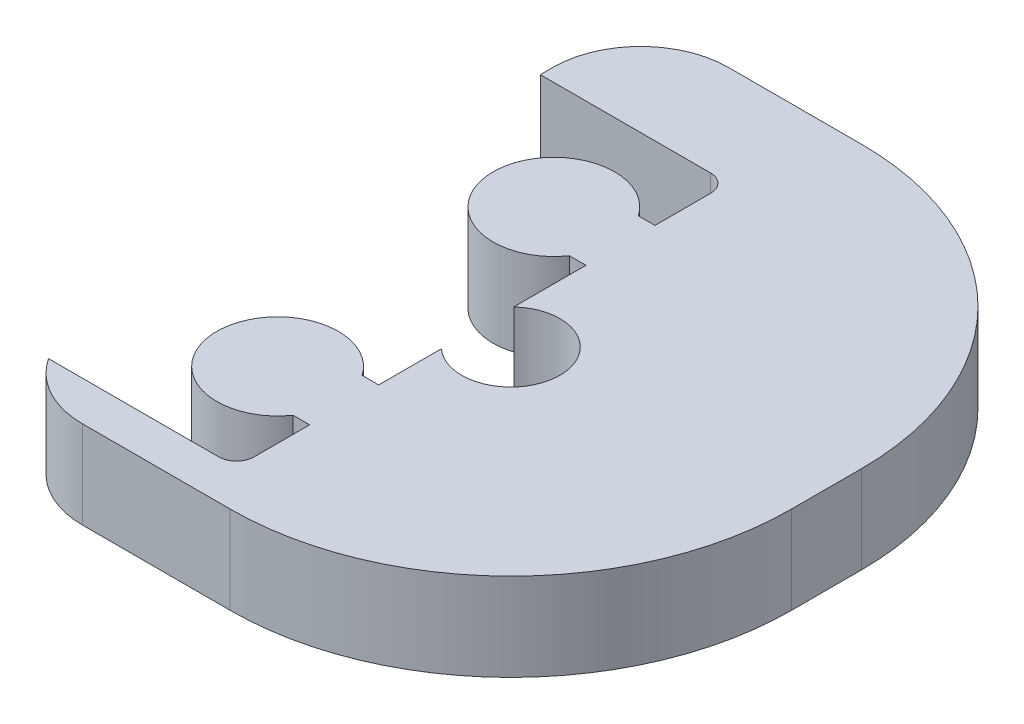
ISO-10303-21;
HEADER;
FILE_DESCRIPTION(('STEP AP214'),'2;1');
FILE_NAME('part.step','',(''),(''),'','','');
FILE_SCHEMA(('AUTOMOTIVE_DESIGN { 1 0 10303 214 1 1 1 1 }'));
ENDSEC;
DATA;
#1=APPLICATION_CONTEXT('core data for automotive mechanical design processes');
#2=APPLICATION_PROTOCOL_DEFINITION('international standard','automotive_design',2000,#1);
#3=PRODUCT_CONTEXT('',#1,'mechanical');
#4=PRODUCT('Part','Part','',(#3));
#5=PRODUCT_RELATED_PRODUCT_CATEGORY('part','',(#4));
#6=PRODUCT_DEFINITION_FORMATION('','',#4);
#7=PRODUCT_DEFINITION_CONTEXT('part definition',#1,'design');
#8=PRODUCT_DEFINITION('design','',#6,#7);
#9=PRODUCT_DEFINITION_SHAPE('','',#8);
#10=(LENGTH_UNIT() NAMED_UNIT(*) SI_UNIT(.MILLI.,.METRE.));
#11=(NAMED_UNIT(*) PLANE_ANGLE_UNIT() SI_UNIT($,.RADIAN.));
#12=(NAMED_UNIT(*) SI_UNIT($,.STERADIAN.) SOLID_ANGLE_UNIT());
#13=UNCERTAINTY_MEASURE_WITH_UNIT(LENGTH_MEASURE(1.E-05),#10,'distance_accuracy_value','');
#14=(GEOMETRIC_REPRESENTATION_CONTEXT(3) GLOBAL_UNCERTAINTY_ASSIGNED_CONTEXT((#13)) GLOBAL_UNIT_ASSIGNED_CONTEXT((#10,
#11,#12)) REPRESENTATION_CONTEXT('',''));
#15=CARTESIAN_POINT('',(0.,0.,0.));
#16=DIRECTION('',(0.,0.,1.));
#17=DIRECTION('',(1.,0.,0.));
#18=AXIS2_PLACEMENT_3D('',#15,#16,#17);
#19=CARTESIAN_POINT('',(-25.4,3.175,11.43));
#20=DIRECTION('',(0.,0.,-1.));
#21=DIRECTION('',(-1.,0.,0.));
#22=AXIS2_PLACEMENT_3D('',#19,#20,#21);
#23=PLANE('',#22);
#24=DIRECTION('',(1.,0.,0.));
#25=VECTOR('',#24,1.);
#26=CARTESIAN_POINT('',(-25.4,3.175,11.43));
#27=LINE('',#26,#25);
#28=CARTESIAN_POINT('',(9.89088521103152,3.175,11.43));
#29=VERTEX_POINT('',#28);
#30=CARTESIAN_POINT('',(15.24,3.175,11.43));
#31=VERTEX_POINT('',#30);
#32=EDGE_CURVE('E299',#29,#31,#27,.T.);
#33=ORIENTED_EDGE('',*,*,#32,.F.);
#34=DIRECTION('',(0.,1.,0.));
#35=VECTOR('',#34,1.);
#36=CARTESIAN_POINT('',(9.89088521103152,3.175,11.43));
#37=LINE('',#36,#35);
#38=CARTESIAN_POINT('',(9.89088521103152,0.,11.43));
#39=VERTEX_POINT('',#38);
#40=EDGE_CURVE('E355',#29,#39,#37,.F.);
#41=ORIENTED_EDGE('',*,*,#40,.T.);
#42=DIRECTION('',(1.,0.,0.));
#43=VECTOR('',#42,1.);
#44=CARTESIAN_POINT('',(-25.4,0.,11.43));
#45=LINE('',#44,#43);
#46=CARTESIAN_POINT('',(15.24,0.,11.43));
#47=VERTEX_POINT('',#46);
#48=EDGE_CURVE('E296',#39,#47,#45,.T.);
#49=ORIENTED_EDGE('',*,*,#48,.T.);
#50=DIRECTION('',(0.,-1.,0.));
#51=VECTOR('',#50,1.);
#52=CARTESIAN_POINT('',(15.24,3.175,11.43));
#53=LINE('',#52,#51);
#54=EDGE_CURVE('E307',#47,#31,#53,.F.);
#55=ORIENTED_EDGE('',*,*,#54,.T.);
#56=EDGE_LOOP('',(#33,#41,#49,#55));
#57=FACE_BOUND('',#56,.T.);
#58=ADVANCED_FACE('F34',(#57),#23,.F.);
#59=CARTESIAN_POINT('',(0.,3.175,0.));
#60=DIRECTION('',(0.,1.,0.));
#61=DIRECTION('',(0.,0.,1.));
#62=AXIS2_PLACEMENT_3D('',#59,#60,#61);
#63=PLANE('',#62);
#64=DIRECTION('',(-1.,0.,0.));
#65=VECTOR('',#64,1.);
#66=CARTESIAN_POINT('',(14.0390310642689,3.175,10.000889408729));
#67=LINE('',#66,#65);
#68=CARTESIAN_POINT('',(13.4040310642689,3.175,10.000889408729));
#69=VERTEX_POINT('',#68);
#70=CARTESIAN_POINT('',(7.239,3.175,10.000889408729));
#71=VERTEX_POINT('',#70);
#72=EDGE_CURVE('E207',#69,#71,#67,.T.);
#73=ORIENTED_EDGE('',*,*,#72,.T.);
#74=CARTESIAN_POINT('',(9.89088521103152,3.175,8.255));
#75=DIRECTION('',(0.,1.,0.));
#76=DIRECTION('',(0.,0.,1.));
#77=AXIS2_PLACEMENT_3D('',#74,#75,#76);
#78=CIRCLE('',#77,3.175);
#79=EDGE_CURVE('E363',#71,#29,#78,.T.);
#80=ORIENTED_EDGE('',*,*,#79,.T.);
#81=ORIENTED_EDGE('',*,*,#32,.T.);
#82=CARTESIAN_POINT('',(15.24,3.175,1.27));
#83=DIRECTION('',(0.,1.,0.));
#84=DIRECTION('',(0.,0.,1.));
#85=AXIS2_PLACEMENT_3D('',#82,#83,#84);
#86=CIRCLE('',#85,10.16);
#87=CARTESIAN_POINT('',(25.4,3.175,1.27));
#88=VERTEX_POINT('',#87);
#89=EDGE_CURVE('E318',#31,#88,#86,.T.);
#90=ORIENTED_EDGE('',*,*,#89,.T.);
#91=DIRECTION('',(0.,0.,-1.));
#92=VECTOR('',#91,1.);
#93=CARTESIAN_POINT('',(25.4,3.175,-11.43));
#94=LINE('',#93,#92);
#95=CARTESIAN_POINT('',(25.4,3.175,-1.27));
#96=VERTEX_POINT('',#95);
#97=EDGE_CURVE('E301',#88,#96,#94,.T.);
#98=ORIENTED_EDGE('',*,*,#97,.T.);
#99=CARTESIAN_POINT('',(15.24,3.175,-1.27));
#100=DIRECTION('',(0.,1.,0.));
#101=DIRECTION('',(0.,0.,1.));
#102=AXIS2_PLACEMENT_3D('',#99,#100,#101);
#103=CIRCLE('',#102,10.16);
#104=CARTESIAN_POINT('',(15.24,3.175,-11.43));
#105=VERTEX_POINT('',#104);
#106=EDGE_CURVE('E328',#96,#105,#103,.T.);
#107=ORIENTED_EDGE('',*,*,#106,.T.);
#108=DIRECTION('',(-1.,0.,0.));
#109=VECTOR('',#108,1.);
#110=CARTESIAN_POINT('',(-25.4,3.175,-11.43));
#111=LINE('',#110,#109);
#112=CARTESIAN_POINT('',(10.414,3.175,-11.43));
#113=VERTEX_POINT('',#112);
#114=EDGE_CURVE('E305',#105,#113,#111,.T.);
#115=ORIENTED_EDGE('',*,*,#114,.T.);
#116=CARTESIAN_POINT('',(10.414,3.175,-8.255));
#117=DIRECTION('',(0.,1.,0.));
#118=DIRECTION('',(0.,0.,1.));
#119=AXIS2_PLACEMENT_3D('',#116,#117,#118);
#120=CIRCLE('',#119,3.175);
#121=CARTESIAN_POINT('',(7.239,3.175,-8.255));
#122=VERTEX_POINT('',#121);
#123=EDGE_CURVE('E49',#113,#122,#120,.T.);
#124=ORIENTED_EDGE('',*,*,#123,.T.);
#125=DIRECTION('',(0.,0.,1.));
#126=VECTOR('',#125,1.);
#127=CARTESIAN_POINT('',(7.239,3.175,-11.43));
#128=LINE('',#127,#126);
#129=CARTESIAN_POINT('',(7.239,3.175,-7.79911059127095));
#130=VERTEX_POINT('',#129);
#131=EDGE_CURVE('E187',#122,#130,#128,.T.);
#132=ORIENTED_EDGE('',*,*,#131,.T.);
#133=DIRECTION('',(1.,0.,0.));
#134=VECTOR('',#133,1.);
#135=CARTESIAN_POINT('',(7.239,3.175,-7.79911059127095));
#136=LINE('',#135,#134);
#137=CARTESIAN_POINT('',(13.4040310642689,3.175,-7.79911059127095));
#138=VERTEX_POINT('',#137);
#139=EDGE_CURVE('E191',#130,#138,#136,.T.);
#140=ORIENTED_EDGE('',*,*,#139,.T.);
#141=CARTESIAN_POINT('',(13.4040310642689,3.175,-7.16411059127095));
#142=DIRECTION('',(0.,1.,0.));
#143=DIRECTION('',(0.,0.,1.));
#144=AXIS2_PLACEMENT_3D('',#141,#142,#143);
#145=CIRCLE('',#144,0.635);
#146=CARTESIAN_POINT('',(14.0390310642689,3.175,-7.16411059127095));
#147=VERTEX_POINT('',#146);
#148=EDGE_CURVE('E353',#138,#147,#145,.F.);
#149=ORIENTED_EDGE('',*,*,#148,.T.);
#150=DIRECTION('',(0.,0.,1.));
#151=VECTOR('',#150,1.);
#152=CARTESIAN_POINT('',(14.0390310642689,3.175,-7.79911059127095));
#153=LINE('',#152,#151);
#154=CARTESIAN_POINT('',(14.0390310642689,3.175,-5.14911059127096));
#155=VERTEX_POINT('',#154);
#156=EDGE_CURVE('E212',#147,#155,#153,.T.);
#157=ORIENTED_EDGE('',*,*,#156,.T.);
#158=DIRECTION('',(1.,0.,0.));
#159=VECTOR('',#158,1.);
#160=CARTESIAN_POINT('',(13.4390310642689,3.175,-5.14911059127096));
#161=LINE('',#160,#159);
#162=CARTESIAN_POINT('',(13.4390310642689,3.175,-5.14911059127096));
#163=VERTEX_POINT('',#162);
#164=EDGE_CURVE('E214',#163,#155,#161,.T.);
#165=ORIENTED_EDGE('',*,*,#164,.F.);
#166=CARTESIAN_POINT('',(11.6286443652424,3.175,-3.89911059127096));
#167=DIRECTION('',(0.,1.,0.));
#168=DIRECTION('',(0.,0.,1.));
#169=AXIS2_PLACEMENT_3D('',#166,#167,#168);
#170=CIRCLE('',#169,2.20000000000277);
#171=CARTESIAN_POINT('',(13.4390310642689,3.175,-2.64911059127096));
#172=VERTEX_POINT('',#171);
#173=EDGE_CURVE('E219',#163,#172,#170,.T.);
#174=ORIENTED_EDGE('',*,*,#173,.T.);
#175=DIRECTION('',(1.,0.,0.));
#176=VECTOR('',#175,1.);
#177=CARTESIAN_POINT('',(13.4390310642689,3.175,-2.64911059127096));
#178=LINE('',#177,#176);
#179=CARTESIAN_POINT('',(14.0390310642689,3.175,-2.64911059127096));
#180=VERTEX_POINT('',#179);
#181=EDGE_CURVE('E222',#172,#180,#178,.T.);
#182=ORIENTED_EDGE('',*,*,#181,.T.);
#183=DIRECTION('',(0.,0.,1.));
#184=VECTOR('',#183,1.);
#185=CARTESIAN_POINT('',(14.0390310642689,3.175,-2.64911059127096));
#186=LINE('',#185,#184);
#187=CARTESIAN_POINT('',(14.0390310642689,3.175,-0.0410902392318066));
#188=VERTEX_POINT('',#187);
#189=EDGE_CURVE('E226',#180,#188,#186,.T.);
#190=ORIENTED_EDGE('',*,*,#189,.T.);
#191=CARTESIAN_POINT('',(15.24,3.175,1.27));
#192=DIRECTION('',(0.,1.,0.));
#193=DIRECTION('',(0.,0.,1.));
#194=AXIS2_PLACEMENT_3D('',#191,#192,#193);
#195=CIRCLE('',#194,1.778);
#196=CARTESIAN_POINT('',(14.0390310642689,3.175,2.58109023923181));
#197=VERTEX_POINT('',#196);
#198=EDGE_CURVE('E275',#197,#188,#195,.T.);
#199=ORIENTED_EDGE('',*,*,#198,.F.);
#200=CARTESIAN_POINT('',(14.0390310642689,3.175,4.85088940872904));
#201=VERTEX_POINT('',#200);
#202=EDGE_CURVE('E225',#197,#201,#186,.T.);
#203=ORIENTED_EDGE('',*,*,#202,.T.);
#204=DIRECTION('',(1.,0.,0.));
#205=VECTOR('',#204,1.);
#206=CARTESIAN_POINT('',(13.4390310642689,3.175,4.85088940872904));
#207=LINE('',#206,#205);
#208=CARTESIAN_POINT('',(13.4390310642689,3.175,4.85088940872904));
#209=VERTEX_POINT('',#208);
#210=EDGE_CURVE('E229',#209,#201,#207,.T.);
#211=ORIENTED_EDGE('',*,*,#210,.F.);
#212=CARTESIAN_POINT('',(11.6286443657494,3.175,6.10088940872904));
#213=DIRECTION('',(0.,1.,0.));
#214=DIRECTION('',(0.,0.,1.));
#215=AXIS2_PLACEMENT_3D('',#212,#213,#214);
#216=CIRCLE('',#215,2.19999999958551);
#217=CARTESIAN_POINT('',(13.4390310642689,3.175,7.35088940872904));
#218=VERTEX_POINT('',#217);
#219=EDGE_CURVE('E231',#209,#218,#216,.T.);
#220=ORIENTED_EDGE('',*,*,#219,.T.);
#221=DIRECTION('',(1.,0.,0.));
#222=VECTOR('',#221,1.);
#223=CARTESIAN_POINT('',(13.4390310642689,3.175,7.35088940872904));
#224=LINE('',#223,#222);
#225=CARTESIAN_POINT('',(14.0390310642689,3.175,7.35088940872904));
#226=VERTEX_POINT('',#225);
#227=EDGE_CURVE('E234',#218,#226,#224,.T.);
#228=ORIENTED_EDGE('',*,*,#227,.T.);
#229=DIRECTION('',(0.,0.,1.));
#230=VECTOR('',#229,1.);
#231=CARTESIAN_POINT('',(14.0390310642689,3.175,7.35088940872904));
#232=LINE('',#231,#230);
#233=CARTESIAN_POINT('',(14.0390310642689,3.175,9.36588940872905));
#234=VERTEX_POINT('',#233);
#235=EDGE_CURVE('E237',#226,#234,#232,.T.);
#236=ORIENTED_EDGE('',*,*,#235,.T.);
#237=CARTESIAN_POINT('',(13.4040310642689,3.175,9.36588940872905));
#238=DIRECTION('',(0.,1.,0.));
#239=DIRECTION('',(0.,0.,1.));
#240=AXIS2_PLACEMENT_3D('',#237,#238,#239);
#241=CIRCLE('',#240,0.635);
#242=EDGE_CURVE('E349',#234,#69,#241,.F.);
#243=ORIENTED_EDGE('',*,*,#242,.T.);
#244=EDGE_LOOP('',(#73,#80,#81,#90,#98,#107,#115,#124,#132,#140,#149,#157,#165,#174,#182,#190,
#199,#203,#211,#220,#228,#236,#243));
#245=FACE_BOUND('',#244,.T.);
#246=ADVANCED_FACE('F189',(#245),#63,.T.);
#247=CARTESIAN_POINT('',(0.,0.,0.));
#248=DIRECTION('',(0.,1.,0.));
#249=DIRECTION('',(0.,0.,1.));
#250=AXIS2_PLACEMENT_3D('',#247,#248,#249);
#251=PLANE('',#250);
#252=ORIENTED_EDGE('',*,*,#48,.F.);
#253=CARTESIAN_POINT('',(9.89088521103152,0.,8.255));
#254=DIRECTION('',(0.,1.,0.));
#255=DIRECTION('',(0.,0.,1.));
#256=AXIS2_PLACEMENT_3D('',#253,#254,#255);
#257=CIRCLE('',#256,3.175);
#258=CARTESIAN_POINT('',(7.239,0.,10.000889408729));
#259=VERTEX_POINT('',#258);
#260=EDGE_CURVE('E360',#39,#259,#257,.F.);
#261=ORIENTED_EDGE('',*,*,#260,.T.);
#262=DIRECTION('',(-1.,0.,0.));
#263=VECTOR('',#262,1.);
#264=CARTESIAN_POINT('',(14.0390310642689,0.,10.000889408729));
#265=LINE('',#264,#263);
#266=CARTESIAN_POINT('',(13.4040310642689,0.,10.000889408729));
#267=VERTEX_POINT('',#266);
#268=EDGE_CURVE('E196',#267,#259,#265,.T.);
#269=ORIENTED_EDGE('',*,*,#268,.F.);
#270=CARTESIAN_POINT('',(13.4040310642689,0.,9.36588940872905));
#271=DIRECTION('',(0.,1.,0.));
#272=DIRECTION('',(0.,0.,1.));
#273=AXIS2_PLACEMENT_3D('',#270,#271,#272);
#274=CIRCLE('',#273,0.635);
#275=CARTESIAN_POINT('',(14.0390310642689,0.,9.36588940872905));
#276=VERTEX_POINT('',#275);
#277=EDGE_CURVE('E347',#267,#276,#274,.T.);
#278=ORIENTED_EDGE('',*,*,#277,.T.);
#279=DIRECTION('',(0.,0.,1.));
#280=VECTOR('',#279,1.);
#281=CARTESIAN_POINT('',(14.0390310642689,0.,7.35088940872904));
#282=LINE('',#281,#280);
#283=CARTESIAN_POINT('',(14.0390310642689,0.,7.35088940872904));
#284=VERTEX_POINT('',#283);
#285=EDGE_CURVE('E267',#284,#276,#282,.T.);
#286=ORIENTED_EDGE('',*,*,#285,.F.);
#287=DIRECTION('',(1.,0.,0.));
#288=VECTOR('',#287,1.);
#289=CARTESIAN_POINT('',(13.4390310642689,0.,7.35088940872904));
#290=LINE('',#289,#288);
#291=CARTESIAN_POINT('',(13.4390310642689,0.,7.35088940872904));
#292=VERTEX_POINT('',#291);
#293=EDGE_CURVE('E264',#292,#284,#290,.T.);
#294=ORIENTED_EDGE('',*,*,#293,.F.);
#295=CARTESIAN_POINT('',(11.6286443657494,0.,6.10088940872904));
#296=DIRECTION('',(0.,1.,0.));
#297=DIRECTION('',(0.,0.,1.));
#298=AXIS2_PLACEMENT_3D('',#295,#296,#297);
#299=CIRCLE('',#298,2.19999999958551);
#300=CARTESIAN_POINT('',(13.4390310642689,0.,4.85088940872904));
#301=VERTEX_POINT('',#300);
#302=EDGE_CURVE('E261',#301,#292,#299,.T.);
#303=ORIENTED_EDGE('',*,*,#302,.F.);
#304=DIRECTION('',(1.,0.,0.));
#305=VECTOR('',#304,1.);
#306=CARTESIAN_POINT('',(13.4390310642689,0.,4.85088940872904));
#307=LINE('',#306,#305);
#308=CARTESIAN_POINT('',(14.0390310642689,0.,4.85088940872904));
#309=VERTEX_POINT('',#308);
#310=EDGE_CURVE('E258',#301,#309,#307,.T.);
#311=ORIENTED_EDGE('',*,*,#310,.T.);
#312=DIRECTION('',(0.,0.,1.));
#313=VECTOR('',#312,1.);
#314=CARTESIAN_POINT('',(14.0390310642689,0.,-2.64911059127096));
#315=LINE('',#314,#313);
#316=CARTESIAN_POINT('',(14.0390310642689,0.,2.58109023923181));
#317=VERTEX_POINT('',#316);
#318=EDGE_CURVE('E255',#317,#309,#315,.T.);
#319=ORIENTED_EDGE('',*,*,#318,.F.);
#320=CARTESIAN_POINT('',(15.24,0.,1.27));
#321=DIRECTION('',(0.,1.,0.));
#322=DIRECTION('',(0.,0.,1.));
#323=AXIS2_PLACEMENT_3D('',#320,#321,#322);
#324=CIRCLE('',#323,1.778);
#325=CARTESIAN_POINT('',(14.0390310642689,0.,-0.0410902392318068));
#326=VERTEX_POINT('',#325);
#327=EDGE_CURVE('E293',#317,#326,#324,.T.);
#328=ORIENTED_EDGE('',*,*,#327,.T.);
#329=CARTESIAN_POINT('',(14.0390310642689,0.,-2.64911059127096));
#330=VERTEX_POINT('',#329);
#331=EDGE_CURVE('E256',#330,#326,#315,.T.);
#332=ORIENTED_EDGE('',*,*,#331,.F.);
#333=DIRECTION('',(1.,0.,0.));
#334=VECTOR('',#333,1.);
#335=CARTESIAN_POINT('',(13.4390310642689,0.,-2.64911059127096));
#336=LINE('',#335,#334);
#337=CARTESIAN_POINT('',(13.4390310642689,0.,-2.64911059127096));
#338=VERTEX_POINT('',#337);
#339=EDGE_CURVE('E252',#338,#330,#336,.T.);
#340=ORIENTED_EDGE('',*,*,#339,.F.);
#341=CARTESIAN_POINT('',(11.6286443652424,0.,-3.89911059127096));
#342=DIRECTION('',(0.,1.,0.));
#343=DIRECTION('',(0.,0.,1.));
#344=AXIS2_PLACEMENT_3D('',#341,#342,#343);
#345=CIRCLE('',#344,2.20000000000277);
#346=CARTESIAN_POINT('',(13.4390310642689,0.,-5.14911059127096));
#347=VERTEX_POINT('',#346);
#348=EDGE_CURVE('E249',#347,#338,#345,.T.);
#349=ORIENTED_EDGE('',*,*,#348,.F.);
#350=DIRECTION('',(1.,0.,0.));
#351=VECTOR('',#350,1.);
#352=CARTESIAN_POINT('',(13.4390310642689,0.,-5.14911059127096));
#353=LINE('',#352,#351);
#354=CARTESIAN_POINT('',(14.0390310642689,0.,-5.14911059127096));
#355=VERTEX_POINT('',#354);
#356=EDGE_CURVE('E246',#347,#355,#353,.T.);
#357=ORIENTED_EDGE('',*,*,#356,.T.);
#358=DIRECTION('',(0.,0.,1.));
#359=VECTOR('',#358,1.);
#360=CARTESIAN_POINT('',(14.0390310642689,0.,-7.79911059127095));
#361=LINE('',#360,#359);
#362=CARTESIAN_POINT('',(14.0390310642689,0.,-7.16411059127095));
#363=VERTEX_POINT('',#362);
#364=EDGE_CURVE('E244',#363,#355,#361,.T.);
#365=ORIENTED_EDGE('',*,*,#364,.F.);
#366=CARTESIAN_POINT('',(13.4040310642689,0.,-7.16411059127095));
#367=DIRECTION('',(0.,1.,0.));
#368=DIRECTION('',(0.,0.,1.));
#369=AXIS2_PLACEMENT_3D('',#366,#367,#368);
#370=CIRCLE('',#369,0.635);
#371=CARTESIAN_POINT('',(13.4040310642689,0.,-7.79911059127095));
#372=VERTEX_POINT('',#371);
#373=EDGE_CURVE('E351',#363,#372,#370,.T.);
#374=ORIENTED_EDGE('',*,*,#373,.T.);
#375=DIRECTION('',(1.,0.,0.));
#376=VECTOR('',#375,1.);
#377=CARTESIAN_POINT('',(7.239,0.,-7.79911059127095));
#378=LINE('',#377,#376);
#379=CARTESIAN_POINT('',(7.239,0.,-7.79911059127095));
#380=VERTEX_POINT('',#379);
#381=EDGE_CURVE('E242',#380,#372,#378,.T.);
#382=ORIENTED_EDGE('',*,*,#381,.F.);
#383=DIRECTION('',(0.,0.,1.));
#384=VECTOR('',#383,1.);
#385=CARTESIAN_POINT('',(7.239,0.,-11.43));
#386=LINE('',#385,#384);
#387=CARTESIAN_POINT('',(7.239,0.,-8.255));
#388=VERTEX_POINT('',#387);
#389=EDGE_CURVE('E202',#388,#380,#386,.T.);
#390=ORIENTED_EDGE('',*,*,#389,.F.);
#391=CARTESIAN_POINT('',(10.414,0.,-8.255));
#392=DIRECTION('',(0.,1.,0.));
#393=DIRECTION('',(0.,0.,1.));
#394=AXIS2_PLACEMENT_3D('',#391,#392,#393);
#395=CIRCLE('',#394,3.175);
#396=CARTESIAN_POINT('',(10.414,0.,-11.43));
#397=VERTEX_POINT('',#396);
#398=EDGE_CURVE('E358',#388,#397,#395,.F.);
#399=ORIENTED_EDGE('',*,*,#398,.T.);
#400=DIRECTION('',(-1.,0.,0.));
#401=VECTOR('',#400,1.);
#402=CARTESIAN_POINT('',(-25.4,0.,-11.43));
#403=LINE('',#402,#401);
#404=CARTESIAN_POINT('',(15.24,0.,-11.43));
#405=VERTEX_POINT('',#404);
#406=EDGE_CURVE('E302',#405,#397,#403,.T.);
#407=ORIENTED_EDGE('',*,*,#406,.F.);
#408=CARTESIAN_POINT('',(15.24,0.,-1.27));
#409=DIRECTION('',(0.,1.,0.));
#410=DIRECTION('',(0.,0.,1.));
#411=AXIS2_PLACEMENT_3D('',#408,#409,#410);
#412=CIRCLE('',#411,10.16);
#413=CARTESIAN_POINT('',(25.4,0.,-1.27));
#414=VERTEX_POINT('',#413);
#415=EDGE_CURVE('E323',#405,#414,#412,.F.);
#416=ORIENTED_EDGE('',*,*,#415,.T.);
#417=DIRECTION('',(0.,0.,-1.));
#418=VECTOR('',#417,1.);
#419=CARTESIAN_POINT('',(25.4,0.,-11.43));
#420=LINE('',#419,#418);
#421=CARTESIAN_POINT('',(25.4,0.,1.27));
#422=VERTEX_POINT('',#421);
#423=EDGE_CURVE('E309',#422,#414,#420,.T.);
#424=ORIENTED_EDGE('',*,*,#423,.F.);
#425=CARTESIAN_POINT('',(15.24,0.,1.27));
#426=DIRECTION('',(0.,1.,0.));
#427=DIRECTION('',(0.,0.,1.));
#428=AXIS2_PLACEMENT_3D('',#425,#426,#427);
#429=CIRCLE('',#428,10.16);
#430=EDGE_CURVE('E315',#422,#47,#429,.F.);
#431=ORIENTED_EDGE('',*,*,#430,.T.);
#432=EDGE_LOOP('',(#252,#261,#269,#278,#286,#294,#303,#311,#319,#328,#332,#340,#349,#357,#365,
#374,#382,#390,#399,#407,#416,#424,#431));
#433=FACE_BOUND('',#432,.T.);
#434=ADVANCED_FACE('F367',(#433),#251,.F.);
#435=CARTESIAN_POINT('',(25.4,3.175,-11.43));
#436=DIRECTION('',(-1.,0.,0.));
#437=DIRECTION('',(0.,0.,1.));
#438=AXIS2_PLACEMENT_3D('',#435,#436,#437);
#439=PLANE('',#438);
#440=ORIENTED_EDGE('',*,*,#423,.T.);
#441=DIRECTION('',(0.,-1.,0.));
#442=VECTOR('',#441,1.);
#443=CARTESIAN_POINT('',(25.4,3.175,-1.27));
#444=LINE('',#443,#442);
#445=EDGE_CURVE('E330',#414,#96,#444,.F.);
#446=ORIENTED_EDGE('',*,*,#445,.T.);
#447=ORIENTED_EDGE('',*,*,#97,.F.);
#448=DIRECTION('',(0.,-1.,0.));
#449=VECTOR('',#448,1.);
#450=CARTESIAN_POINT('',(25.4,3.175,1.27));
#451=LINE('',#450,#449);
#452=EDGE_CURVE('E320',#88,#422,#451,.T.);
#453=ORIENTED_EDGE('',*,*,#452,.T.);
#454=EDGE_LOOP('',(#440,#446,#447,#453));
#455=FACE_BOUND('',#454,.T.);
#456=ADVANCED_FACE('F441',(#455),#439,.F.);
#457=CARTESIAN_POINT('',(-25.4,3.175,-11.43));
#458=DIRECTION('',(0.,0.,1.));
#459=DIRECTION('',(1.,0.,0.));
#460=AXIS2_PLACEMENT_3D('',#457,#458,#459);
#461=PLANE('',#460);
#462=ORIENTED_EDGE('',*,*,#406,.T.);
#463=DIRECTION('',(0.,-1.,0.));
#464=VECTOR('',#463,1.);
#465=CARTESIAN_POINT('',(10.414,3.175,-11.43));
#466=LINE('',#465,#464);
#467=EDGE_CURVE('E11',#397,#113,#466,.F.);
#468=ORIENTED_EDGE('',*,*,#467,.T.);
#469=ORIENTED_EDGE('',*,*,#114,.F.);
#470=DIRECTION('',(0.,-1.,0.));
#471=VECTOR('',#470,1.);
#472=CARTESIAN_POINT('',(15.24,3.175,-11.43));
#473=LINE('',#472,#471);
#474=EDGE_CURVE('E325',#105,#405,#473,.T.);
#475=ORIENTED_EDGE('',*,*,#474,.T.);
#476=EDGE_LOOP('',(#462,#468,#469,#475));
#477=FACE_BOUND('',#476,.T.);
#478=ADVANCED_FACE('F448',(#477),#461,.F.);
#479=CARTESIAN_POINT('',(15.24,3.175,1.27));
#480=DIRECTION('',(0.,-1.,0.));
#481=DIRECTION('',(0.,0.,-1.));
#482=AXIS2_PLACEMENT_3D('',#479,#480,#481);
#483=CYLINDRICAL_SURFACE('',#482,10.16);
#484=ORIENTED_EDGE('',*,*,#89,.F.);
#485=ORIENTED_EDGE('',*,*,#54,.F.);
#486=ORIENTED_EDGE('',*,*,#430,.F.);
#487=ORIENTED_EDGE('',*,*,#452,.F.);
#488=EDGE_LOOP('',(#484,#485,#486,#487));
#489=FACE_BOUND('',#488,.T.);
#490=ADVANCED_FACE('F444',(#489),#483,.T.);
#491=CARTESIAN_POINT('',(15.24,0.,1.27));
#492=DIRECTION('',(0.,1.,0.));
#493=DIRECTION('',(0.,0.,1.));
#494=AXIS2_PLACEMENT_3D('',#491,#492,#493);
#495=CYLINDRICAL_SURFACE('',#494,1.778);
#496=ORIENTED_EDGE('',*,*,#198,.T.);
#497=DIRECTION('',(0.,1.,0.));
#498=VECTOR('',#497,1.);
#499=CARTESIAN_POINT('',(14.0390310642689,0.,-0.0410902392318066));
#500=LINE('',#499,#498);
#501=EDGE_CURVE('E335',#188,#326,#500,.F.);
#502=ORIENTED_EDGE('',*,*,#501,.T.);
#503=ORIENTED_EDGE('',*,*,#327,.F.);
#504=DIRECTION('',(0.,1.,0.));
#505=VECTOR('',#504,1.);
#506=CARTESIAN_POINT('',(14.0390310642689,0.,2.58109023923181));
#507=LINE('',#506,#505);
#508=EDGE_CURVE('E332',#317,#197,#507,.T.);
#509=ORIENTED_EDGE('',*,*,#508,.T.);
#510=EDGE_LOOP('',(#496,#502,#503,#509));
#511=FACE_BOUND('',#510,.T.);
#512=ADVANCED_FACE('F396',(#511),#495,.F.);
#513=CARTESIAN_POINT('',(15.24,3.175,-1.27));
#514=DIRECTION('',(0.,-1.,0.));
#515=DIRECTION('',(0.,0.,-1.));
#516=AXIS2_PLACEMENT_3D('',#513,#514,#515);
#517=CYLINDRICAL_SURFACE('',#516,10.16);
#518=ORIENTED_EDGE('',*,*,#106,.F.);
#519=ORIENTED_EDGE('',*,*,#445,.F.);
#520=ORIENTED_EDGE('',*,*,#415,.F.);
#521=ORIENTED_EDGE('',*,*,#474,.F.);
#522=EDGE_LOOP('',(#518,#519,#520,#521));
#523=FACE_BOUND('',#522,.T.);
#524=ADVANCED_FACE('F446',(#523),#517,.T.);
#525=CARTESIAN_POINT('',(14.0390310642689,3.175,-2.64911059127096));
#526=DIRECTION('',(1.,0.,0.));
#527=DIRECTION('',(0.,0.,-1.));
#528=AXIS2_PLACEMENT_3D('',#525,#526,#527);
#529=PLANE('',#528);
#530=ORIENTED_EDGE('',*,*,#318,.T.);
#531=DIRECTION('',(0.,-1.,0.));
#532=VECTOR('',#531,1.);
#533=CARTESIAN_POINT('',(14.0390310642689,3.175,4.85088940872904));
#534=LINE('',#533,#532);
#535=EDGE_CURVE('E282',#201,#309,#534,.T.);
#536=ORIENTED_EDGE('',*,*,#535,.F.);
#537=ORIENTED_EDGE('',*,*,#202,.F.);
#538=ORIENTED_EDGE('',*,*,#508,.F.);
#539=EDGE_LOOP('',(#530,#536,#537,#538));
#540=FACE_BOUND('',#539,.T.);
#541=ADVANCED_FACE('F402',(#540),#529,.F.);
#542=CARTESIAN_POINT('',(13.4390310642689,3.175,4.85088940872904));
#543=DIRECTION('',(0.,0.,-1.));
#544=DIRECTION('',(-1.,0.,0.));
#545=AXIS2_PLACEMENT_3D('',#542,#543,#544);
#546=PLANE('',#545);
#547=ORIENTED_EDGE('',*,*,#310,.F.);
#548=DIRECTION('',(0.,-1.,0.));
#549=VECTOR('',#548,1.);
#550=CARTESIAN_POINT('',(13.4390310642689,3.175,4.85088940872904));
#551=LINE('',#550,#549);
#552=EDGE_CURVE('E280',#209,#301,#551,.T.);
#553=ORIENTED_EDGE('',*,*,#552,.F.);
#554=ORIENTED_EDGE('',*,*,#210,.T.);
#555=ORIENTED_EDGE('',*,*,#535,.T.);
#556=EDGE_LOOP('',(#547,#553,#554,#555));
#557=FACE_BOUND('',#556,.T.);
#558=ADVANCED_FACE('F405',(#557),#546,.T.);
#559=CARTESIAN_POINT('',(11.6286443657494,3.175,6.10088940872904));
#560=DIRECTION('',(0.,-1.,0.));
#561=DIRECTION('',(0.,0.,-1.));
#562=AXIS2_PLACEMENT_3D('',#559,#560,#561);
#563=CYLINDRICAL_SURFACE('',#562,2.19999999958551);
#564=ORIENTED_EDGE('',*,*,#302,.T.);
#565=DIRECTION('',(0.,-1.,0.));
#566=VECTOR('',#565,1.);
#567=CARTESIAN_POINT('',(13.4390310642689,3.175,7.35088940872904));
#568=LINE('',#567,#566);
#569=EDGE_CURVE('E278',#218,#292,#568,.T.);
#570=ORIENTED_EDGE('',*,*,#569,.F.);
#571=ORIENTED_EDGE('',*,*,#219,.F.);
#572=ORIENTED_EDGE('',*,*,#552,.T.);
#573=EDGE_LOOP('',(#564,#570,#571,#572));
#574=FACE_BOUND('',#573,.T.);
#575=ADVANCED_FACE('F410',(#574),#563,.T.);
#576=CARTESIAN_POINT('',(13.4390310642689,3.175,7.35088940872904));
#577=DIRECTION('',(0.,0.,-1.));
#578=DIRECTION('',(-1.,0.,0.));
#579=AXIS2_PLACEMENT_3D('',#576,#577,#578);
#580=PLANE('',#579);
#581=ORIENTED_EDGE('',*,*,#293,.T.);
#582=DIRECTION('',(0.,-1.,0.));
#583=VECTOR('',#582,1.);
#584=CARTESIAN_POINT('',(14.0390310642689,3.175,7.35088940872904));
#585=LINE('',#584,#583);
#586=EDGE_CURVE('E276',#226,#284,#585,.T.);
#587=ORIENTED_EDGE('',*,*,#586,.F.);
#588=ORIENTED_EDGE('',*,*,#227,.F.);
#589=ORIENTED_EDGE('',*,*,#569,.T.);
#590=EDGE_LOOP('',(#581,#587,#588,#589));
#591=FACE_BOUND('',#590,.T.);
#592=ADVANCED_FACE('F413',(#591),#580,.F.);
#593=CARTESIAN_POINT('',(14.0390310642689,3.175,7.35088940872904));
#594=DIRECTION('',(1.,0.,0.));
#595=DIRECTION('',(0.,0.,-1.));
#596=AXIS2_PLACEMENT_3D('',#593,#594,#595);
#597=PLANE('',#596);
#598=ORIENTED_EDGE('',*,*,#285,.T.);
#599=DIRECTION('',(0.,-1.,0.));
#600=VECTOR('',#599,1.);
#601=CARTESIAN_POINT('',(14.0390310642689,3.175,9.36588940872905));
#602=LINE('',#601,#600);
#603=EDGE_CURVE('E341',#276,#234,#602,.F.);
#604=ORIENTED_EDGE('',*,*,#603,.T.);
#605=ORIENTED_EDGE('',*,*,#235,.F.);
#606=ORIENTED_EDGE('',*,*,#586,.T.);
#607=EDGE_LOOP('',(#598,#604,#605,#606));
#608=FACE_BOUND('',#607,.T.);
#609=ADVANCED_FACE('F417',(#608),#597,.F.);
#610=CARTESIAN_POINT('',(14.0390310642689,3.175,10.000889408729));
#611=DIRECTION('',(0.,0.,1.));
#612=DIRECTION('',(1.,0.,0.));
#613=AXIS2_PLACEMENT_3D('',#610,#611,#612);
#614=PLANE('',#613);
#615=ORIENTED_EDGE('',*,*,#72,.F.);
#616=DIRECTION('',(0.,-1.,0.));
#617=VECTOR('',#616,1.);
#618=CARTESIAN_POINT('',(13.4040310642689,0.,10.000889408729));
#619=LINE('',#618,#617);
#620=EDGE_CURVE('E338',#69,#267,#619,.T.);
#621=ORIENTED_EDGE('',*,*,#620,.T.);
#622=ORIENTED_EDGE('',*,*,#268,.T.);
#623=DIRECTION('',(0.,-1.,0.));
#624=VECTOR('',#623,1.);
#625=CARTESIAN_POINT('',(7.239,3.175,10.000889408729));
#626=LINE('',#625,#624);
#627=EDGE_CURVE('E272',#71,#259,#626,.T.);
#628=ORIENTED_EDGE('',*,*,#627,.F.);
#629=EDGE_LOOP('',(#615,#621,#622,#628));
#630=FACE_BOUND('',#629,.T.);
#631=ADVANCED_FACE('F426',(#630),#614,.F.);
#632=ORIENTED_EDGE('',*,*,#189,.F.);
#633=DIRECTION('',(0.,-1.,0.));
#634=VECTOR('',#633,1.);
#635=CARTESIAN_POINT('',(14.0390310642689,3.175,-2.64911059127096));
#636=LINE('',#635,#634);
#637=EDGE_CURVE('E285',#180,#330,#636,.T.);
#638=ORIENTED_EDGE('',*,*,#637,.T.);
#639=ORIENTED_EDGE('',*,*,#331,.T.);
#640=ORIENTED_EDGE('',*,*,#501,.F.);
#641=EDGE_LOOP('',(#632,#638,#639,#640));
#642=FACE_BOUND('',#641,.T.);
#643=ADVANCED_FACE('F393',(#642),#529,.F.);
#644=CARTESIAN_POINT('',(7.239,3.175,-11.43));
#645=DIRECTION('',(1.,0.,0.));
#646=DIRECTION('',(0.,0.,-1.));
#647=AXIS2_PLACEMENT_3D('',#644,#645,#646);
#648=PLANE('',#647);
#649=ORIENTED_EDGE('',*,*,#131,.F.);
#650=DIRECTION('',(0.,-1.,0.));
#651=VECTOR('',#650,1.);
#652=CARTESIAN_POINT('',(7.239,3.175,-8.255));
#653=LINE('',#652,#651);
#654=EDGE_CURVE('E42',#122,#388,#653,.T.);
#655=ORIENTED_EDGE('',*,*,#654,.T.);
#656=ORIENTED_EDGE('',*,*,#389,.T.);
#657=DIRECTION('',(0.,-1.,0.));
#658=VECTOR('',#657,1.);
#659=CARTESIAN_POINT('',(7.239,3.175,-7.79911059127095));
#660=LINE('',#659,#658);
#661=EDGE_CURVE('E199',#130,#380,#660,.T.);
#662=ORIENTED_EDGE('',*,*,#661,.F.);
#663=EDGE_LOOP('',(#649,#655,#656,#662));
#664=FACE_BOUND('',#663,.T.);
#665=ADVANCED_FACE('F200',(#664),#648,.F.);
#666=CARTESIAN_POINT('',(13.4390310642689,3.175,-2.64911059127096));
#667=DIRECTION('',(0.,0.,-1.));
#668=DIRECTION('',(-1.,0.,0.));
#669=AXIS2_PLACEMENT_3D('',#666,#667,#668);
#670=PLANE('',#669);
#671=ORIENTED_EDGE('',*,*,#339,.T.);
#672=ORIENTED_EDGE('',*,*,#637,.F.);
#673=ORIENTED_EDGE('',*,*,#181,.F.);
#674=DIRECTION('',(0.,-1.,0.));
#675=VECTOR('',#674,1.);
#676=CARTESIAN_POINT('',(13.4390310642689,3.175,-2.64911059127096));
#677=LINE('',#676,#675);
#678=EDGE_CURVE('E287',#172,#338,#677,.T.);
#679=ORIENTED_EDGE('',*,*,#678,.T.);
#680=EDGE_LOOP('',(#671,#672,#673,#679));
#681=FACE_BOUND('',#680,.T.);
#682=ADVANCED_FACE('F391',(#681),#670,.F.);
#683=CARTESIAN_POINT('',(11.6286443652424,3.175,-3.89911059127096));
#684=DIRECTION('',(0.,-1.,0.));
#685=DIRECTION('',(0.,0.,-1.));
#686=AXIS2_PLACEMENT_3D('',#683,#684,#685);
#687=CYLINDRICAL_SURFACE('',#686,2.20000000000277);
#688=ORIENTED_EDGE('',*,*,#348,.T.);
#689=ORIENTED_EDGE('',*,*,#678,.F.);
#690=ORIENTED_EDGE('',*,*,#173,.F.);
#691=DIRECTION('',(0.,-1.,0.));
#692=VECTOR('',#691,1.);
#693=CARTESIAN_POINT('',(13.4390310642689,3.175,-5.14911059127096));
#694=LINE('',#693,#692);
#695=EDGE_CURVE('E289',#163,#347,#694,.T.);
#696=ORIENTED_EDGE('',*,*,#695,.T.);
#697=EDGE_LOOP('',(#688,#689,#690,#696));
#698=FACE_BOUND('',#697,.T.);
#699=ADVANCED_FACE('F385',(#698),#687,.T.);
#700=CARTESIAN_POINT('',(13.4390310642689,3.175,-5.14911059127096));
#701=DIRECTION('',(0.,0.,-1.));
#702=DIRECTION('',(-1.,0.,0.));
#703=AXIS2_PLACEMENT_3D('',#700,#701,#702);
#704=PLANE('',#703);
#705=ORIENTED_EDGE('',*,*,#356,.F.);
#706=ORIENTED_EDGE('',*,*,#695,.F.);
#707=ORIENTED_EDGE('',*,*,#164,.T.);
#708=DIRECTION('',(0.,-1.,0.));
#709=VECTOR('',#708,1.);
#710=CARTESIAN_POINT('',(14.0390310642689,3.175,-5.14911059127096));
#711=LINE('',#710,#709);
#712=EDGE_CURVE('E206',#155,#355,#711,.T.);
#713=ORIENTED_EDGE('',*,*,#712,.T.);
#714=EDGE_LOOP('',(#705,#706,#707,#713));
#715=FACE_BOUND('',#714,.T.);
#716=ADVANCED_FACE('F380',(#715),#704,.T.);
#717=CARTESIAN_POINT('',(14.0390310642689,3.175,-7.79911059127095));
#718=DIRECTION('',(1.,0.,0.));
#719=DIRECTION('',(0.,0.,-1.));
#720=AXIS2_PLACEMENT_3D('',#717,#718,#719);
#721=PLANE('',#720);
#722=ORIENTED_EDGE('',*,*,#156,.F.);
#723=DIRECTION('',(0.,-1.,0.));
#724=VECTOR('',#723,1.);
#725=CARTESIAN_POINT('',(14.0390310642689,0.,-7.16411059127095));
#726=LINE('',#725,#724);
#727=EDGE_CURVE('E343',#147,#363,#726,.T.);
#728=ORIENTED_EDGE('',*,*,#727,.T.);
#729=ORIENTED_EDGE('',*,*,#364,.T.);
#730=ORIENTED_EDGE('',*,*,#712,.F.);
#731=EDGE_LOOP('',(#722,#728,#729,#730));
#732=FACE_BOUND('',#731,.T.);
#733=ADVANCED_FACE('F377',(#732),#721,.F.);
#734=CARTESIAN_POINT('',(7.239,3.175,-7.79911059127095));
#735=DIRECTION('',(0.,0.,-1.));
#736=DIRECTION('',(-1.,0.,0.));
#737=AXIS2_PLACEMENT_3D('',#734,#735,#736);
#738=PLANE('',#737);
#739=ORIENTED_EDGE('',*,*,#381,.T.);
#740=DIRECTION('',(0.,-1.,0.));
#741=VECTOR('',#740,1.);
#742=CARTESIAN_POINT('',(13.4040310642689,3.175,-7.79911059127095));
#743=LINE('',#742,#741);
#744=EDGE_CURVE('E211',#372,#138,#743,.F.);
#745=ORIENTED_EDGE('',*,*,#744,.T.);
#746=ORIENTED_EDGE('',*,*,#139,.F.);
#747=ORIENTED_EDGE('',*,*,#661,.T.);
#748=EDGE_LOOP('',(#739,#745,#746,#747));
#749=FACE_BOUND('',#748,.T.);
#750=ADVANCED_FACE('F209',(#749),#738,.F.);
#751=CARTESIAN_POINT('',(13.4040310642689,3.175,9.36588940872905));
#752=DIRECTION('',(0.,1.,0.));
#753=DIRECTION('',(0.,0.,1.));
#754=AXIS2_PLACEMENT_3D('',#751,#752,#753);
#755=CYLINDRICAL_SURFACE('',#754,0.635);
#756=ORIENTED_EDGE('',*,*,#242,.F.);
#757=ORIENTED_EDGE('',*,*,#603,.F.);
#758=ORIENTED_EDGE('',*,*,#277,.F.);
#759=ORIENTED_EDGE('',*,*,#620,.F.);
#760=EDGE_LOOP('',(#756,#757,#758,#759));
#761=FACE_BOUND('',#760,.T.);
#762=ADVANCED_FACE('F423',(#761),#755,.F.);
#763=CARTESIAN_POINT('',(13.4040310642689,3.175,-7.16411059127095));
#764=DIRECTION('',(0.,1.,0.));
#765=DIRECTION('',(0.,0.,1.));
#766=AXIS2_PLACEMENT_3D('',#763,#764,#765);
#767=CYLINDRICAL_SURFACE('',#766,0.635);
#768=ORIENTED_EDGE('',*,*,#148,.F.);
#769=ORIENTED_EDGE('',*,*,#744,.F.);
#770=ORIENTED_EDGE('',*,*,#373,.F.);
#771=ORIENTED_EDGE('',*,*,#727,.F.);
#772=EDGE_LOOP('',(#768,#769,#770,#771));
#773=FACE_BOUND('',#772,.T.);
#774=ADVANCED_FACE('F371',(#773),#767,.F.);
#775=CARTESIAN_POINT('',(9.89088521103152,3.175,8.255));
#776=DIRECTION('',(0.,1.,0.));
#777=DIRECTION('',(0.,0.,1.));
#778=AXIS2_PLACEMENT_3D('',#775,#776,#777);
#779=CYLINDRICAL_SURFACE('',#778,3.175);
#780=ORIENTED_EDGE('',*,*,#79,.F.);
#781=ORIENTED_EDGE('',*,*,#627,.T.);
#782=ORIENTED_EDGE('',*,*,#260,.F.);
#783=ORIENTED_EDGE('',*,*,#40,.F.);
#784=EDGE_LOOP('',(#780,#781,#782,#783));
#785=FACE_BOUND('',#784,.T.);
#786=ADVANCED_FACE('F431',(#785),#779,.T.);
#787=CARTESIAN_POINT('',(10.414,3.175,-8.255));
#788=DIRECTION('',(0.,-1.,0.));
#789=DIRECTION('',(0.,0.,-1.));
#790=AXIS2_PLACEMENT_3D('',#787,#788,#789);
#791=CYLINDRICAL_SURFACE('',#790,3.175);
#792=ORIENTED_EDGE('',*,*,#123,.F.);
#793=ORIENTED_EDGE('',*,*,#467,.F.);
#794=ORIENTED_EDGE('',*,*,#398,.F.);
#795=ORIENTED_EDGE('',*,*,#654,.F.);
#796=EDGE_LOOP('',(#792,#793,#794,#795));
#797=FACE_BOUND('',#796,.T.);
#798=ADVANCED_FACE('F36',(#797),#791,.T.);
#799=CLOSED_SHELL('',(#58,#246,#434,#456,#478,#490,#512,#524,#541,#558,#575,#592,#609,#631,#643,
#665,#682,#699,#716,#733,#750,#762,#774,#786,#798));
#800=MANIFOLD_SOLID_BREP('B2',#799);
#801=ADVANCED_BREP_SHAPE_REPRESENTATION('',(#18,#800),#14);
#802=SHAPE_DEFINITION_REPRESENTATION(#9,#801);
ENDSEC;
END-ISO-10303-21;
